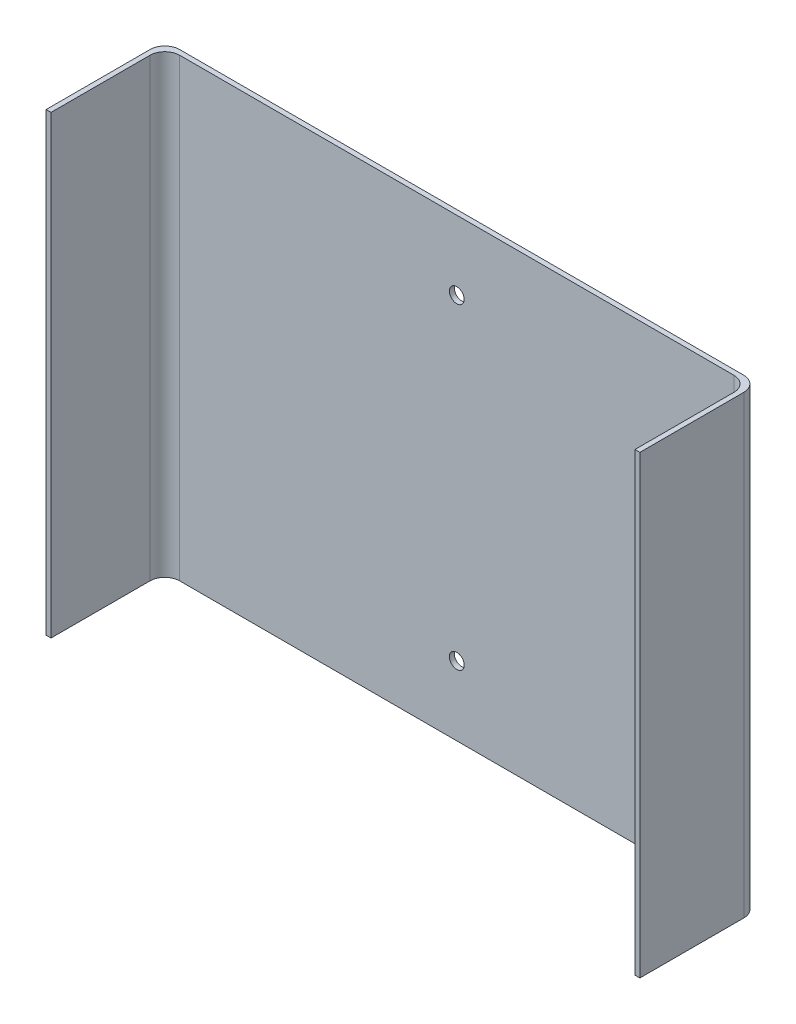
ISO-10303-21;
HEADER;
FILE_DESCRIPTION(('STEP AP214'),'2;1');
FILE_NAME('part.step','',(''),(''),'','','');
FILE_SCHEMA(('AUTOMOTIVE_DESIGN { 1 0 10303 214 1 1 1 1 }'));
ENDSEC;
DATA;
#1=APPLICATION_CONTEXT('core data for automotive mechanical design processes');
#2=APPLICATION_PROTOCOL_DEFINITION('international standard','automotive_design',2000,#1);
#3=PRODUCT_CONTEXT('',#1,'mechanical');
#4=PRODUCT('Part','Part','',(#3));
#5=PRODUCT_RELATED_PRODUCT_CATEGORY('part','',(#4));
#6=PRODUCT_DEFINITION_FORMATION('','',#4);
#7=PRODUCT_DEFINITION_CONTEXT('part definition',#1,'design');
#8=PRODUCT_DEFINITION('design','',#6,#7);
#9=PRODUCT_DEFINITION_SHAPE('','',#8);
#10=(LENGTH_UNIT() NAMED_UNIT(*) SI_UNIT(.MILLI.,.METRE.));
#11=(NAMED_UNIT(*) PLANE_ANGLE_UNIT() SI_UNIT($,.RADIAN.));
#12=(NAMED_UNIT(*) SI_UNIT($,.STERADIAN.) SOLID_ANGLE_UNIT());
#13=UNCERTAINTY_MEASURE_WITH_UNIT(LENGTH_MEASURE(1.E-05),#10,'distance_accuracy_value','');
#14=(GEOMETRIC_REPRESENTATION_CONTEXT(3) GLOBAL_UNCERTAINTY_ASSIGNED_CONTEXT((#13)) GLOBAL_UNIT_ASSIGNED_CONTEXT((#10,
#11,#12)) REPRESENTATION_CONTEXT('',''));
#15=CARTESIAN_POINT('',(0.,0.,0.));
#16=DIRECTION('',(0.,0.,1.));
#17=DIRECTION('',(1.,0.,0.));
#18=AXIS2_PLACEMENT_3D('',#15,#16,#17);
#19=CARTESIAN_POINT('',(0.,0.,1.));
#20=DIRECTION('',(0.,0.,1.));
#21=DIRECTION('',(1.,0.,0.));
#22=AXIS2_PLACEMENT_3D('',#19,#20,#21);
#23=PLANE('',#22);
#24=DIRECTION('',(1.,0.,0.));
#25=VECTOR('',#24,1.);
#26=CARTESIAN_POINT('',(-60.0000000000001,-46.0000000000001,1.));
#27=LINE('',#26,#25);
#28=CARTESIAN_POINT('',(-56.0000000000001,-46.0000000000001,1.));
#29=VERTEX_POINT('',#28);
#30=CARTESIAN_POINT('',(56.0000000000001,-46.0000000000001,1.));
#31=VERTEX_POINT('',#30);
#32=EDGE_CURVE('E188',#29,#31,#27,.T.);
#33=ORIENTED_EDGE('',*,*,#32,.T.);
#34=DIRECTION('',(0.,1.,0.));
#35=VECTOR('',#34,1.);
#36=CARTESIAN_POINT('',(56.0000000000001,45.9999999999998,1.));
#37=LINE('',#36,#35);
#38=CARTESIAN_POINT('',(56.0000000000001,45.9999999999998,1.));
#39=VERTEX_POINT('',#38);
#40=EDGE_CURVE('E227',#31,#39,#37,.T.);
#41=ORIENTED_EDGE('',*,*,#40,.T.);
#42=DIRECTION('',(-1.,0.,0.));
#43=VECTOR('',#42,1.);
#44=CARTESIAN_POINT('',(-60.0000000000001,45.9999999999998,1.));
#45=LINE('',#44,#43);
#46=CARTESIAN_POINT('',(-56.0000000000001,45.9999999999998,1.));
#47=VERTEX_POINT('',#46);
#48=EDGE_CURVE('E186',#39,#47,#45,.T.);
#49=ORIENTED_EDGE('',*,*,#48,.T.);
#50=DIRECTION('',(0.,1.,0.));
#51=VECTOR('',#50,1.);
#52=CARTESIAN_POINT('',(-56.0000000000001,0.,1.));
#53=LINE('',#52,#51);
#54=EDGE_CURVE('E213',#47,#29,#53,.F.);
#55=ORIENTED_EDGE('',*,*,#54,.T.);
#56=EDGE_LOOP('',(#33,#41,#49,#55));
#57=FACE_BOUND('',#56,.T.);
#58=CARTESIAN_POINT('',(0.,-32.0000000000002,1.));
#59=DIRECTION('',(0.,0.,1.));
#60=DIRECTION('',(1.,0.,0.));
#61=AXIS2_PLACEMENT_3D('',#58,#59,#60);
#62=CIRCLE('',#61,1.5);
#63=CARTESIAN_POINT('',(1.5,-32.0000000000002,1.));
#64=VERTEX_POINT('',#63);
#65=EDGE_CURVE('E180',#64,#64,#62,.T.);
#66=ORIENTED_EDGE('',*,*,#65,.F.);
#67=EDGE_LOOP('',(#66));
#68=FACE_BOUND('',#67,.T.);
#69=CARTESIAN_POINT('',(0.,32.0000000000002,1.));
#70=DIRECTION('',(0.,0.,1.));
#71=DIRECTION('',(-1.,0.,0.));
#72=AXIS2_PLACEMENT_3D('',#69,#70,#71);
#73=CIRCLE('',#72,1.5);
#74=CARTESIAN_POINT('',(-1.5,32.0000000000002,1.));
#75=VERTEX_POINT('',#74);
#76=EDGE_CURVE('E174',#75,#75,#73,.T.);
#77=ORIENTED_EDGE('',*,*,#76,.F.);
#78=EDGE_LOOP('',(#77));
#79=FACE_BOUND('',#78,.T.);
#80=ADVANCED_FACE('F35',(#57,#68,#79),#23,.T.);
#81=CARTESIAN_POINT('',(0.,0.,0.));
#82=DIRECTION('',(0.,0.,1.));
#83=DIRECTION('',(1.,0.,0.));
#84=AXIS2_PLACEMENT_3D('',#81,#82,#83);
#85=PLANE('',#84);
#86=DIRECTION('',(-1.,0.,0.));
#87=VECTOR('',#86,1.);
#88=CARTESIAN_POINT('',(-60.0000000000001,45.9999999999998,0.));
#89=LINE('',#88,#87);
#90=CARTESIAN_POINT('',(56.9999999999999,45.9999999999998,0.));
#91=VERTEX_POINT('',#90);
#92=CARTESIAN_POINT('',(-57.0000000000001,45.9999999999998,0.));
#93=VERTEX_POINT('',#92);
#94=EDGE_CURVE('E183',#91,#93,#89,.T.);
#95=ORIENTED_EDGE('',*,*,#94,.F.);
#96=DIRECTION('',(0.,1.,0.));
#97=VECTOR('',#96,1.);
#98=CARTESIAN_POINT('',(56.9999999999999,0.,0.));
#99=LINE('',#98,#97);
#100=CARTESIAN_POINT('',(56.9999999999999,-46.0000000000001,0.));
#101=VERTEX_POINT('',#100);
#102=EDGE_CURVE('E223',#91,#101,#99,.F.);
#103=ORIENTED_EDGE('',*,*,#102,.T.);
#104=DIRECTION('',(1.,0.,0.));
#105=VECTOR('',#104,1.);
#106=CARTESIAN_POINT('',(-60.0000000000001,-46.0000000000001,0.));
#107=LINE('',#106,#105);
#108=CARTESIAN_POINT('',(-57.0000000000001,-46.0000000000001,0.));
#109=VERTEX_POINT('',#108);
#110=EDGE_CURVE('E189',#109,#101,#107,.T.);
#111=ORIENTED_EDGE('',*,*,#110,.F.);
#112=DIRECTION('',(0.,-1.,0.));
#113=VECTOR('',#112,1.);
#114=CARTESIAN_POINT('',(-57.0000000000001,0.,0.));
#115=LINE('',#114,#113);
#116=EDGE_CURVE('E205',#109,#93,#115,.F.);
#117=ORIENTED_EDGE('',*,*,#116,.T.);
#118=EDGE_LOOP('',(#95,#103,#111,#117));
#119=FACE_BOUND('',#118,.T.);
#120=CARTESIAN_POINT('',(0.,-32.0000000000002,0.));
#121=DIRECTION('',(0.,0.,1.));
#122=DIRECTION('',(1.,0.,0.));
#123=AXIS2_PLACEMENT_3D('',#120,#121,#122);
#124=CIRCLE('',#123,1.5);
#125=CARTESIAN_POINT('',(1.5,-32.0000000000002,0.));
#126=VERTEX_POINT('',#125);
#127=EDGE_CURVE('E177',#126,#126,#124,.T.);
#128=ORIENTED_EDGE('',*,*,#127,.T.);
#129=EDGE_LOOP('',(#128));
#130=FACE_BOUND('',#129,.T.);
#131=CARTESIAN_POINT('',(0.,32.0000000000002,0.));
#132=DIRECTION('',(0.,0.,1.));
#133=DIRECTION('',(-1.,0.,0.));
#134=AXIS2_PLACEMENT_3D('',#131,#132,#133);
#135=CIRCLE('',#134,1.5);
#136=CARTESIAN_POINT('',(-1.5,32.0000000000002,0.));
#137=VERTEX_POINT('',#136);
#138=EDGE_CURVE('E173',#137,#137,#135,.T.);
#139=ORIENTED_EDGE('',*,*,#138,.T.);
#140=EDGE_LOOP('',(#139));
#141=FACE_BOUND('',#140,.T.);
#142=ADVANCED_FACE('F261',(#119,#130,#141),#85,.F.);
#143=CARTESIAN_POINT('',(59.9999999999999,45.9999999999998,1.));
#144=DIRECTION('',(-1.,0.,0.));
#145=DIRECTION('',(0.,-1.,0.));
#146=AXIS2_PLACEMENT_3D('',#143,#144,#145);
#147=PLANE('',#146);
#148=DIRECTION('',(0.,0.,-1.));
#149=VECTOR('',#148,1.);
#150=CARTESIAN_POINT('',(59.9999999999999,-46.0000000000001,1.));
#151=LINE('',#150,#149);
#152=CARTESIAN_POINT('',(60.0000000000001,-46.0000000000001,24.));
#153=VERTEX_POINT('',#152);
#154=CARTESIAN_POINT('',(59.9999999999999,-46.0000000000001,3.));
#155=VERTEX_POINT('',#154);
#156=EDGE_CURVE('E191',#153,#155,#151,.T.);
#157=ORIENTED_EDGE('',*,*,#156,.T.);
#158=DIRECTION('',(0.,1.,0.));
#159=VECTOR('',#158,1.);
#160=CARTESIAN_POINT('',(59.9999999999999,45.9999999999998,3.));
#161=LINE('',#160,#159);
#162=CARTESIAN_POINT('',(59.9999999999999,45.9999999999998,3.));
#163=VERTEX_POINT('',#162);
#164=EDGE_CURVE('E132',#155,#163,#161,.T.);
#165=ORIENTED_EDGE('',*,*,#164,.T.);
#166=DIRECTION('',(0.,0.,-1.));
#167=VECTOR('',#166,1.);
#168=CARTESIAN_POINT('',(59.9999999999999,45.9999999999998,1.));
#169=LINE('',#168,#167);
#170=CARTESIAN_POINT('',(60.0000000000001,45.9999999999998,24.));
#171=VERTEX_POINT('',#170);
#172=EDGE_CURVE('E125',#171,#163,#169,.T.);
#173=ORIENTED_EDGE('',*,*,#172,.F.);
#174=DIRECTION('',(0.,-1.,0.));
#175=VECTOR('',#174,1.);
#176=CARTESIAN_POINT('',(60.0000000000001,-46.0000000000001,24.));
#177=LINE('',#176,#175);
#178=EDGE_CURVE('E129',#171,#153,#177,.T.);
#179=ORIENTED_EDGE('',*,*,#178,.T.);
#180=EDGE_LOOP('',(#157,#165,#173,#179));
#181=FACE_BOUND('',#180,.T.);
#182=ADVANCED_FACE('F128',(#181),#147,.F.);
#183=CARTESIAN_POINT('',(-60.0000000000001,45.9999999999998,1.));
#184=DIRECTION('',(0.,-1.,0.));
#185=DIRECTION('',(0.,0.,-1.));
#186=AXIS2_PLACEMENT_3D('',#183,#184,#185);
#187=PLANE('',#186);
#188=ORIENTED_EDGE('',*,*,#172,.T.);
#189=CARTESIAN_POINT('',(56.9999999999999,45.9999999999998,3.));
#190=DIRECTION('',(0.,-1.,0.));
#191=DIRECTION('',(0.,0.,-1.));
#192=AXIS2_PLACEMENT_3D('',#189,#190,#191);
#193=CIRCLE('',#192,3.);
#194=EDGE_CURVE('E221',#163,#91,#193,.F.);
#195=ORIENTED_EDGE('',*,*,#194,.T.);
#196=ORIENTED_EDGE('',*,*,#94,.T.);
#197=CARTESIAN_POINT('',(-57.0000000000001,45.9999999999998,3.));
#198=DIRECTION('',(0.,-1.,0.));
#199=DIRECTION('',(0.,0.,-1.));
#200=AXIS2_PLACEMENT_3D('',#197,#198,#199);
#201=CIRCLE('',#200,3.);
#202=CARTESIAN_POINT('',(-60.0000000000001,45.9999999999998,3.));
#203=VERTEX_POINT('',#202);
#204=EDGE_CURVE('E208',#93,#203,#201,.F.);
#205=ORIENTED_EDGE('',*,*,#204,.T.);
#206=DIRECTION('',(0.,0.,-1.));
#207=VECTOR('',#206,1.);
#208=CARTESIAN_POINT('',(-60.0000000000001,45.9999999999998,1.));
#209=LINE('',#208,#207);
#210=CARTESIAN_POINT('',(-60.0000000000001,45.9999999999998,24.));
#211=VERTEX_POINT('',#210);
#212=EDGE_CURVE('E136',#211,#203,#209,.T.);
#213=ORIENTED_EDGE('',*,*,#212,.F.);
#214=DIRECTION('',(-1.,0.,0.));
#215=VECTOR('',#214,1.);
#216=CARTESIAN_POINT('',(-60.0000000000001,45.9999999999998,24.));
#217=LINE('',#216,#215);
#218=CARTESIAN_POINT('',(-59.0000000000001,45.9999999999998,24.));
#219=VERTEX_POINT('',#218);
#220=EDGE_CURVE('E164',#219,#211,#217,.T.);
#221=ORIENTED_EDGE('',*,*,#220,.F.);
#222=DIRECTION('',(0.,0.,-1.));
#223=VECTOR('',#222,1.);
#224=CARTESIAN_POINT('',(-59.0000000000001,45.9999999999998,24.));
#225=LINE('',#224,#223);
#226=CARTESIAN_POINT('',(-59.0000000000001,45.9999999999998,4.));
#227=VERTEX_POINT('',#226);
#228=EDGE_CURVE('E167',#219,#227,#225,.T.);
#229=ORIENTED_EDGE('',*,*,#228,.T.);
#230=CARTESIAN_POINT('',(-56.0000000000001,45.9999999999998,4.));
#231=DIRECTION('',(0.,-1.,0.));
#232=DIRECTION('',(0.,0.,-1.));
#233=AXIS2_PLACEMENT_3D('',#230,#231,#232);
#234=CIRCLE('',#233,3.);
#235=EDGE_CURVE('E215',#227,#47,#234,.T.);
#236=ORIENTED_EDGE('',*,*,#235,.T.);
#237=ORIENTED_EDGE('',*,*,#48,.F.);
#238=CARTESIAN_POINT('',(56.0000000000001,45.9999999999998,4.));
#239=DIRECTION('',(0.,-1.,0.));
#240=DIRECTION('',(0.,0.,-1.));
#241=AXIS2_PLACEMENT_3D('',#238,#239,#240);
#242=CIRCLE('',#241,3.);
#243=CARTESIAN_POINT('',(59.0000000000001,45.9999999999998,4.));
#244=VERTEX_POINT('',#243);
#245=EDGE_CURVE('E43',#39,#244,#242,.T.);
#246=ORIENTED_EDGE('',*,*,#245,.T.);
#247=DIRECTION('',(0.,0.,-1.));
#248=VECTOR('',#247,1.);
#249=CARTESIAN_POINT('',(59.0000000000001,45.9999999999998,24.));
#250=LINE('',#249,#248);
#251=CARTESIAN_POINT('',(59.0000000000001,45.9999999999998,24.));
#252=VERTEX_POINT('',#251);
#253=EDGE_CURVE('E148',#252,#244,#250,.T.);
#254=ORIENTED_EDGE('',*,*,#253,.F.);
#255=DIRECTION('',(1.,0.,0.));
#256=VECTOR('',#255,1.);
#257=CARTESIAN_POINT('',(60.0000000000001,45.9999999999998,24.));
#258=LINE('',#257,#256);
#259=EDGE_CURVE('E142',#252,#171,#258,.T.);
#260=ORIENTED_EDGE('',*,*,#259,.T.);
#261=EDGE_LOOP('',(#188,#195,#196,#205,#213,#221,#229,#236,#237,#246,#254,#260));
#262=FACE_BOUND('',#261,.T.);
#263=ADVANCED_FACE('F147',(#262),#187,.F.);
#264=CARTESIAN_POINT('',(-60.0000000000001,45.9999999999998,1.));
#265=DIRECTION('',(1.,0.,0.));
#266=DIRECTION('',(0.,1.,0.));
#267=AXIS2_PLACEMENT_3D('',#264,#265,#266);
#268=PLANE('',#267);
#269=ORIENTED_EDGE('',*,*,#212,.T.);
#270=DIRECTION('',(0.,-1.,0.));
#271=VECTOR('',#270,1.);
#272=CARTESIAN_POINT('',(-60.0000000000001,45.9999999999998,3.));
#273=LINE('',#272,#271);
#274=CARTESIAN_POINT('',(-60.0000000000001,-46.0000000000001,3.));
#275=VERTEX_POINT('',#274);
#276=EDGE_CURVE('E135',#203,#275,#273,.T.);
#277=ORIENTED_EDGE('',*,*,#276,.T.);
#278=DIRECTION('',(0.,0.,-1.));
#279=VECTOR('',#278,1.);
#280=CARTESIAN_POINT('',(-60.0000000000001,-46.0000000000001,1.));
#281=LINE('',#280,#279);
#282=CARTESIAN_POINT('',(-60.0000000000001,-46.0000000000001,24.));
#283=VERTEX_POINT('',#282);
#284=EDGE_CURVE('E196',#283,#275,#281,.T.);
#285=ORIENTED_EDGE('',*,*,#284,.F.);
#286=DIRECTION('',(0.,-1.,0.));
#287=VECTOR('',#286,1.);
#288=CARTESIAN_POINT('',(-60.0000000000001,-46.0000000000001,24.));
#289=LINE('',#288,#287);
#290=EDGE_CURVE('E157',#211,#283,#289,.T.);
#291=ORIENTED_EDGE('',*,*,#290,.F.);
#292=EDGE_LOOP('',(#269,#277,#285,#291));
#293=FACE_BOUND('',#292,.T.);
#294=ADVANCED_FACE('F252',(#293),#268,.F.);
#295=CARTESIAN_POINT('',(-60.0000000000001,-46.0000000000001,1.));
#296=DIRECTION('',(0.,1.,0.));
#297=DIRECTION('',(0.,0.,1.));
#298=AXIS2_PLACEMENT_3D('',#295,#296,#297);
#299=PLANE('',#298);
#300=ORIENTED_EDGE('',*,*,#110,.T.);
#301=CARTESIAN_POINT('',(56.9999999999999,-46.0000000000001,3.));
#302=DIRECTION('',(0.,1.,0.));
#303=DIRECTION('',(0.,0.,1.));
#304=AXIS2_PLACEMENT_3D('',#301,#302,#303);
#305=CIRCLE('',#304,3.);
#306=EDGE_CURVE('E225',#101,#155,#305,.F.);
#307=ORIENTED_EDGE('',*,*,#306,.T.);
#308=ORIENTED_EDGE('',*,*,#156,.F.);
#309=DIRECTION('',(-1.,0.,0.));
#310=VECTOR('',#309,1.);
#311=CARTESIAN_POINT('',(60.0000000000001,-46.0000000000001,24.));
#312=LINE('',#311,#310);
#313=CARTESIAN_POINT('',(59.0000000000001,-46.0000000000001,24.));
#314=VERTEX_POINT('',#313);
#315=EDGE_CURVE('E145',#153,#314,#312,.T.);
#316=ORIENTED_EDGE('',*,*,#315,.T.);
#317=DIRECTION('',(0.,0.,-1.));
#318=VECTOR('',#317,1.);
#319=CARTESIAN_POINT('',(59.0000000000001,-46.0000000000001,24.));
#320=LINE('',#319,#318);
#321=CARTESIAN_POINT('',(59.0000000000001,-46.0000000000001,4.));
#322=VERTEX_POINT('',#321);
#323=EDGE_CURVE('E154',#314,#322,#320,.T.);
#324=ORIENTED_EDGE('',*,*,#323,.T.);
#325=CARTESIAN_POINT('',(56.0000000000001,-46.0000000000001,4.));
#326=DIRECTION('',(0.,1.,0.));
#327=DIRECTION('',(0.,0.,1.));
#328=AXIS2_PLACEMENT_3D('',#325,#326,#327);
#329=CIRCLE('',#328,3.);
#330=EDGE_CURVE('E11',#322,#31,#329,.T.);
#331=ORIENTED_EDGE('',*,*,#330,.T.);
#332=ORIENTED_EDGE('',*,*,#32,.F.);
#333=CARTESIAN_POINT('',(-56.0000000000001,-46.0000000000001,4.));
#334=DIRECTION('',(0.,1.,0.));
#335=DIRECTION('',(0.,0.,1.));
#336=AXIS2_PLACEMENT_3D('',#333,#334,#335);
#337=CIRCLE('',#336,3.);
#338=CARTESIAN_POINT('',(-59.0000000000001,-46.0000000000001,4.));
#339=VERTEX_POINT('',#338);
#340=EDGE_CURVE('E218',#29,#339,#337,.T.);
#341=ORIENTED_EDGE('',*,*,#340,.T.);
#342=DIRECTION('',(0.,0.,-1.));
#343=VECTOR('',#342,1.);
#344=CARTESIAN_POINT('',(-59.0000000000001,-46.0000000000001,24.));
#345=LINE('',#344,#343);
#346=CARTESIAN_POINT('',(-59.0000000000001,-46.0000000000001,24.));
#347=VERTEX_POINT('',#346);
#348=EDGE_CURVE('E170',#347,#339,#345,.T.);
#349=ORIENTED_EDGE('',*,*,#348,.F.);
#350=DIRECTION('',(1.,0.,0.));
#351=VECTOR('',#350,1.);
#352=CARTESIAN_POINT('',(-60.0000000000001,-46.0000000000001,24.));
#353=LINE('',#352,#351);
#354=EDGE_CURVE('E160',#283,#347,#353,.T.);
#355=ORIENTED_EDGE('',*,*,#354,.F.);
#356=ORIENTED_EDGE('',*,*,#284,.T.);
#357=CARTESIAN_POINT('',(-57.0000000000001,-46.0000000000001,3.));
#358=DIRECTION('',(0.,1.,0.));
#359=DIRECTION('',(0.,0.,1.));
#360=AXIS2_PLACEMENT_3D('',#357,#358,#359);
#361=CIRCLE('',#360,3.);
#362=EDGE_CURVE('E203',#275,#109,#361,.F.);
#363=ORIENTED_EDGE('',*,*,#362,.T.);
#364=EDGE_LOOP('',(#300,#307,#308,#316,#324,#331,#332,#341,#349,#355,#356,#363));
#365=FACE_BOUND('',#364,.T.);
#366=ADVANCED_FACE('F238',(#365),#299,.F.);
#367=CARTESIAN_POINT('',(0.,-32.0000000000002,1.));
#368=DIRECTION('',(0.,0.,-1.));
#369=DIRECTION('',(-1.,0.,0.));
#370=AXIS2_PLACEMENT_3D('',#367,#368,#369);
#371=CYLINDRICAL_SURFACE('',#370,1.5);
#372=ORIENTED_EDGE('',*,*,#65,.T.);
#373=EDGE_LOOP('',(#372));
#374=FACE_BOUND('',#373,.T.);
#375=ORIENTED_EDGE('',*,*,#127,.F.);
#376=EDGE_LOOP('',(#375));
#377=FACE_BOUND('',#376,.T.);
#378=ADVANCED_FACE('F282',(#374,#377),#371,.F.);
#379=CARTESIAN_POINT('',(0.,32.0000000000002,1.));
#380=DIRECTION('',(0.,0.,-1.));
#381=DIRECTION('',(-1.,0.,0.));
#382=AXIS2_PLACEMENT_3D('',#379,#380,#381);
#383=CYLINDRICAL_SURFACE('',#382,1.5);
#384=ORIENTED_EDGE('',*,*,#76,.T.);
#385=EDGE_LOOP('',(#384));
#386=FACE_BOUND('',#385,.T.);
#387=ORIENTED_EDGE('',*,*,#138,.F.);
#388=EDGE_LOOP('',(#387));
#389=FACE_BOUND('',#388,.T.);
#390=ADVANCED_FACE('F305',(#386,#389),#383,.F.);
#391=CARTESIAN_POINT('',(-59.0000000000001,-46.0000000000001,24.));
#392=DIRECTION('',(-1.,0.,0.));
#393=DIRECTION('',(0.,0.,1.));
#394=AXIS2_PLACEMENT_3D('',#391,#392,#393);
#395=PLANE('',#394);
#396=ORIENTED_EDGE('',*,*,#348,.T.);
#397=DIRECTION('',(0.,1.,0.));
#398=VECTOR('',#397,1.);
#399=CARTESIAN_POINT('',(-59.0000000000001,-46.0000000000001,4.));
#400=LINE('',#399,#398);
#401=EDGE_CURVE('E210',#339,#227,#400,.T.);
#402=ORIENTED_EDGE('',*,*,#401,.T.);
#403=ORIENTED_EDGE('',*,*,#228,.F.);
#404=DIRECTION('',(0.,1.,0.));
#405=VECTOR('',#404,1.);
#406=CARTESIAN_POINT('',(-59.0000000000001,-46.0000000000001,24.));
#407=LINE('',#406,#405);
#408=EDGE_CURVE('E162',#347,#219,#407,.T.);
#409=ORIENTED_EDGE('',*,*,#408,.F.);
#410=EDGE_LOOP('',(#396,#402,#403,#409));
#411=FACE_BOUND('',#410,.T.);
#412=ADVANCED_FACE('F245',(#411),#395,.F.);
#413=CARTESIAN_POINT('',(0.,0.,24.));
#414=DIRECTION('',(0.,0.,-1.));
#415=DIRECTION('',(-1.,0.,0.));
#416=AXIS2_PLACEMENT_3D('',#413,#414,#415);
#417=PLANE('',#416);
#418=ORIENTED_EDGE('',*,*,#290,.T.);
#419=ORIENTED_EDGE('',*,*,#354,.T.);
#420=ORIENTED_EDGE('',*,*,#408,.T.);
#421=ORIENTED_EDGE('',*,*,#220,.T.);
#422=EDGE_LOOP('',(#418,#419,#420,#421));
#423=FACE_BOUND('',#422,.T.);
#424=ADVANCED_FACE('F250',(#423),#417,.F.);
#425=CARTESIAN_POINT('',(-57.0000000000001,45.9999999999998,3.));
#426=DIRECTION('',(0.,-1.,0.));
#427=DIRECTION('',(1.,0.,0.));
#428=AXIS2_PLACEMENT_3D('',#425,#426,#427);
#429=CYLINDRICAL_SURFACE('',#428,3.);
#430=ORIENTED_EDGE('',*,*,#204,.F.);
#431=ORIENTED_EDGE('',*,*,#116,.F.);
#432=ORIENTED_EDGE('',*,*,#362,.F.);
#433=ORIENTED_EDGE('',*,*,#276,.F.);
#434=EDGE_LOOP('',(#430,#431,#432,#433));
#435=FACE_BOUND('',#434,.T.);
#436=ADVANCED_FACE('F265',(#435),#429,.T.);
#437=CARTESIAN_POINT('',(-56.0000000000001,-46.0000000000001,4.));
#438=DIRECTION('',(0.,1.,0.));
#439=DIRECTION('',(0.,0.,1.));
#440=AXIS2_PLACEMENT_3D('',#437,#438,#439);
#441=CYLINDRICAL_SURFACE('',#440,3.);
#442=ORIENTED_EDGE('',*,*,#340,.F.);
#443=ORIENTED_EDGE('',*,*,#54,.F.);
#444=ORIENTED_EDGE('',*,*,#235,.F.);
#445=ORIENTED_EDGE('',*,*,#401,.F.);
#446=EDGE_LOOP('',(#442,#443,#444,#445));
#447=FACE_BOUND('',#446,.T.);
#448=ADVANCED_FACE('F242',(#447),#441,.F.);
#449=CARTESIAN_POINT('',(59.0000000000001,-46.0000000000001,24.));
#450=DIRECTION('',(-1.,0.,0.));
#451=DIRECTION('',(0.,0.,1.));
#452=AXIS2_PLACEMENT_3D('',#449,#450,#451);
#453=PLANE('',#452);
#454=ORIENTED_EDGE('',*,*,#253,.T.);
#455=DIRECTION('',(0.,1.,0.));
#456=VECTOR('',#455,1.);
#457=CARTESIAN_POINT('',(59.0000000000001,-46.0000000000001,4.));
#458=LINE('',#457,#456);
#459=EDGE_CURVE('E56',#244,#322,#458,.F.);
#460=ORIENTED_EDGE('',*,*,#459,.T.);
#461=ORIENTED_EDGE('',*,*,#323,.F.);
#462=DIRECTION('',(0.,1.,0.));
#463=VECTOR('',#462,1.);
#464=CARTESIAN_POINT('',(59.0000000000001,-46.0000000000001,24.));
#465=LINE('',#464,#463);
#466=EDGE_CURVE('E149',#314,#252,#465,.T.);
#467=ORIENTED_EDGE('',*,*,#466,.T.);
#468=EDGE_LOOP('',(#454,#460,#461,#467));
#469=FACE_BOUND('',#468,.T.);
#470=ADVANCED_FACE('F233',(#469),#453,.T.);
#471=CARTESIAN_POINT('',(0.,0.,24.));
#472=DIRECTION('',(0.,0.,-1.));
#473=DIRECTION('',(1.,0.,0.));
#474=AXIS2_PLACEMENT_3D('',#471,#472,#473);
#475=PLANE('',#474);
#476=ORIENTED_EDGE('',*,*,#178,.F.);
#477=ORIENTED_EDGE('',*,*,#259,.F.);
#478=ORIENTED_EDGE('',*,*,#466,.F.);
#479=ORIENTED_EDGE('',*,*,#315,.F.);
#480=EDGE_LOOP('',(#476,#477,#478,#479));
#481=FACE_BOUND('',#480,.T.);
#482=ADVANCED_FACE('F140',(#481),#475,.F.);
#483=CARTESIAN_POINT('',(56.9999999999999,45.9999999999998,3.));
#484=DIRECTION('',(0.,1.,0.));
#485=DIRECTION('',(-1.,0.,0.));
#486=AXIS2_PLACEMENT_3D('',#483,#484,#485);
#487=CYLINDRICAL_SURFACE('',#486,3.);
#488=ORIENTED_EDGE('',*,*,#306,.F.);
#489=ORIENTED_EDGE('',*,*,#102,.F.);
#490=ORIENTED_EDGE('',*,*,#194,.F.);
#491=ORIENTED_EDGE('',*,*,#164,.F.);
#492=EDGE_LOOP('',(#488,#489,#490,#491));
#493=FACE_BOUND('',#492,.T.);
#494=ADVANCED_FACE('F267',(#493),#487,.T.);
#495=CARTESIAN_POINT('',(56.0000000000001,0.,4.));
#496=DIRECTION('',(0.,-1.,0.));
#497=DIRECTION('',(0.,0.,-1.));
#498=AXIS2_PLACEMENT_3D('',#495,#496,#497);
#499=CYLINDRICAL_SURFACE('',#498,3.);
#500=ORIENTED_EDGE('',*,*,#330,.F.);
#501=ORIENTED_EDGE('',*,*,#459,.F.);
#502=ORIENTED_EDGE('',*,*,#245,.F.);
#503=ORIENTED_EDGE('',*,*,#40,.F.);
#504=EDGE_LOOP('',(#500,#501,#502,#503));
#505=FACE_BOUND('',#504,.T.);
#506=ADVANCED_FACE('F37',(#505),#499,.F.);
#507=CLOSED_SHELL('',(#80,#142,#182,#263,#294,#366,#378,#390,#412,#424,#436,#448,#470,#482,#494,#506));
#508=MANIFOLD_SOLID_BREP('B2',#507);
#509=ADVANCED_BREP_SHAPE_REPRESENTATION('',(#18,#508),#14);
#510=SHAPE_DEFINITION_REPRESENTATION(#9,#509);
ENDSEC;
END-ISO-10303-21;
